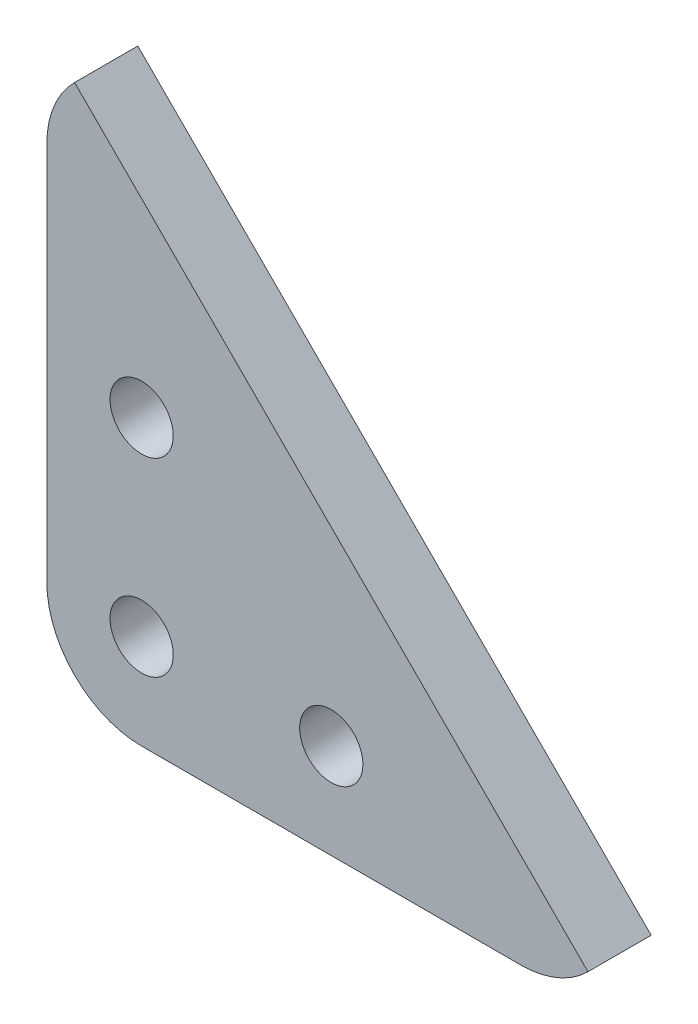
ISO-10303-21;
HEADER;
FILE_DESCRIPTION(('STEP AP214'),'2;1');
FILE_NAME('part.step','',(''),(''),'','','');
FILE_SCHEMA(('AUTOMOTIVE_DESIGN { 1 0 10303 214 1 1 1 1 }'));
ENDSEC;
DATA;
#1=APPLICATION_CONTEXT('core data for automotive mechanical design processes');
#2=APPLICATION_PROTOCOL_DEFINITION('international standard','automotive_design',2000,#1);
#3=PRODUCT_CONTEXT('',#1,'mechanical');
#4=PRODUCT('Part','Part','',(#3));
#5=PRODUCT_RELATED_PRODUCT_CATEGORY('part','',(#4));
#6=PRODUCT_DEFINITION_FORMATION('','',#4);
#7=PRODUCT_DEFINITION_CONTEXT('part definition',#1,'design');
#8=PRODUCT_DEFINITION('design','',#6,#7);
#9=PRODUCT_DEFINITION_SHAPE('','',#8);
#10=(LENGTH_UNIT() NAMED_UNIT(*) SI_UNIT(.MILLI.,.METRE.));
#11=(NAMED_UNIT(*) PLANE_ANGLE_UNIT() SI_UNIT($,.RADIAN.));
#12=(NAMED_UNIT(*) SI_UNIT($,.STERADIAN.) SOLID_ANGLE_UNIT());
#13=UNCERTAINTY_MEASURE_WITH_UNIT(LENGTH_MEASURE(1.E-05),#10,'distance_accuracy_value','');
#14=(GEOMETRIC_REPRESENTATION_CONTEXT(3) GLOBAL_UNCERTAINTY_ASSIGNED_CONTEXT((#13)) GLOBAL_UNIT_ASSIGNED_CONTEXT((#10,
#11,#12)) REPRESENTATION_CONTEXT('',''));
#15=CARTESIAN_POINT('',(0.,0.,0.));
#16=DIRECTION('',(0.,0.,1.));
#17=DIRECTION('',(1.,0.,0.));
#18=AXIS2_PLACEMENT_3D('',#15,#16,#17);
#19=CARTESIAN_POINT('',(-101.443383637,101.056539337921,3.));
#20=DIRECTION('',(0.,0.,1.));
#21=DIRECTION('',(1.,0.,0.));
#22=AXIS2_PLACEMENT_3D('',#19,#20,#21);
#23=PLANE('',#22);
#24=CARTESIAN_POINT('',(-101.443383637,83.056539338,3.));
#25=DIRECTION('',(0.,0.,1.));
#26=DIRECTION('',(1.,0.,0.));
#27=AXIS2_PLACEMENT_3D('',#24,#25,#26);
#28=CIRCLE('',#27,1.5);
#29=CARTESIAN_POINT('',(-99.943383637,83.056539338,3.));
#30=VERTEX_POINT('',#29);
#31=EDGE_CURVE('E185',#30,#30,#28,.T.);
#32=ORIENTED_EDGE('',*,*,#31,.F.);
#33=EDGE_LOOP('',(#32));
#34=FACE_BOUND('',#33,.T.);
#35=CARTESIAN_POINT('',(-101.443383637,101.056539337921,3.));
#36=DIRECTION('',(0.,0.,1.));
#37=DIRECTION('',(1.,0.,0.));
#38=AXIS2_PLACEMENT_3D('',#35,#36,#37);
#39=CIRCLE('',#38,4.50000000000001);
#40=CARTESIAN_POINT('',(-104.6253641523,104.2385198533,3.));
#41=VERTEX_POINT('',#40);
#42=CARTESIAN_POINT('',(-105.943383637,101.056539338,3.));
#43=VERTEX_POINT('',#42);
#44=EDGE_CURVE('E129',#41,#43,#39,.T.);
#45=ORIENTED_EDGE('',*,*,#44,.T.);
#46=DIRECTION('',(0.,-1.,0.));
#47=VECTOR('',#46,1.);
#48=CARTESIAN_POINT('',(-105.943383637,101.056539338,3.));
#49=LINE('',#48,#47);
#50=CARTESIAN_POINT('',(-105.943383637,83.056539338,3.));
#51=VERTEX_POINT('',#50);
#52=EDGE_CURVE('E87',#43,#51,#49,.T.);
#53=ORIENTED_EDGE('',*,*,#52,.T.);
#54=CARTESIAN_POINT('',(-101.443383637,83.056539338,3.));
#55=DIRECTION('',(0.,0.,1.));
#56=DIRECTION('',(1.,0.,0.));
#57=AXIS2_PLACEMENT_3D('',#54,#55,#56);
#58=CIRCLE('',#57,4.5);
#59=CARTESIAN_POINT('',(-101.443383637,78.556539338,3.));
#60=VERTEX_POINT('',#59);
#61=EDGE_CURVE('E100',#51,#60,#58,.T.);
#62=ORIENTED_EDGE('',*,*,#61,.T.);
#63=DIRECTION('',(1.,0.,0.));
#64=VECTOR('',#63,1.);
#65=CARTESIAN_POINT('',(-101.443383637,78.556539338,3.));
#66=LINE('',#65,#64);
#67=CARTESIAN_POINT('',(-83.443383637,78.556539338,3.));
#68=VERTEX_POINT('',#67);
#69=EDGE_CURVE('E94',#60,#68,#66,.T.);
#70=ORIENTED_EDGE('',*,*,#69,.T.);
#71=CARTESIAN_POINT('',(-83.4433836370789,83.056539338,3.));
#72=DIRECTION('',(0.,0.,1.));
#73=DIRECTION('',(1.,0.,0.));
#74=AXIS2_PLACEMENT_3D('',#71,#72,#73);
#75=CIRCLE('',#74,4.5);
#76=CARTESIAN_POINT('',(-80.2614031217,79.8745588227,3.));
#77=VERTEX_POINT('',#76);
#78=EDGE_CURVE('E98',#68,#77,#75,.T.);
#79=ORIENTED_EDGE('',*,*,#78,.T.);
#80=DIRECTION('',(-0.707106781186547,0.707106781186548,0.));
#81=VECTOR('',#80,1.);
#82=CARTESIAN_POINT('',(-104.6253641523,104.2385198533,3.));
#83=LINE('',#82,#81);
#84=EDGE_CURVE('E50',#77,#41,#83,.T.);
#85=ORIENTED_EDGE('',*,*,#84,.T.);
#86=EDGE_LOOP('',(#45,#53,#62,#70,#79,#85));
#87=FACE_BOUND('',#86,.T.);
#88=CARTESIAN_POINT('',(-101.443383637,92.056539338,3.));
#89=DIRECTION('',(0.,0.,1.));
#90=DIRECTION('',(1.,0.,0.));
#91=AXIS2_PLACEMENT_3D('',#88,#89,#90);
#92=CIRCLE('',#91,1.5);
#93=CARTESIAN_POINT('',(-99.943383637,92.056539338,3.));
#94=VERTEX_POINT('',#93);
#95=EDGE_CURVE('E122',#94,#94,#92,.T.);
#96=ORIENTED_EDGE('',*,*,#95,.F.);
#97=EDGE_LOOP('',(#96));
#98=FACE_BOUND('',#97,.T.);
#99=CARTESIAN_POINT('',(-92.443383637,83.056539338,3.));
#100=DIRECTION('',(0.,0.,1.));
#101=DIRECTION('',(1.,0.,0.));
#102=AXIS2_PLACEMENT_3D('',#99,#100,#101);
#103=CIRCLE('',#102,1.5);
#104=CARTESIAN_POINT('',(-90.943383637,83.056539338,3.));
#105=VERTEX_POINT('',#104);
#106=EDGE_CURVE('E176',#105,#105,#103,.T.);
#107=ORIENTED_EDGE('',*,*,#106,.F.);
#108=EDGE_LOOP('',(#107));
#109=FACE_BOUND('',#108,.T.);
#110=ADVANCED_FACE('F33',(#34,#87,#98,#109),#23,.T.);
#111=CARTESIAN_POINT('',(-101.443383637,101.056539337921,0.));
#112=DIRECTION('',(0.,0.,1.));
#113=DIRECTION('',(1.,0.,0.));
#114=AXIS2_PLACEMENT_3D('',#111,#112,#113);
#115=PLANE('',#114);
#116=CARTESIAN_POINT('',(-101.443383637,83.056539338,0.));
#117=DIRECTION('',(0.,0.,1.));
#118=DIRECTION('',(1.,0.,0.));
#119=AXIS2_PLACEMENT_3D('',#116,#117,#118);
#120=CIRCLE('',#119,1.5);
#121=CARTESIAN_POINT('',(-99.943383637,83.056539338,0.));
#122=VERTEX_POINT('',#121);
#123=EDGE_CURVE('E182',#122,#122,#120,.T.);
#124=ORIENTED_EDGE('',*,*,#123,.T.);
#125=EDGE_LOOP('',(#124));
#126=FACE_BOUND('',#125,.T.);
#127=CARTESIAN_POINT('',(-101.443383637,101.056539337921,0.));
#128=DIRECTION('',(0.,0.,1.));
#129=DIRECTION('',(1.,0.,0.));
#130=AXIS2_PLACEMENT_3D('',#127,#128,#129);
#131=CIRCLE('',#130,4.50000000000001);
#132=CARTESIAN_POINT('',(-104.6253641523,104.2385198533,0.));
#133=VERTEX_POINT('',#132);
#134=CARTESIAN_POINT('',(-105.943383637,101.056539338,0.));
#135=VERTEX_POINT('',#134);
#136=EDGE_CURVE('E118',#133,#135,#131,.T.);
#137=ORIENTED_EDGE('',*,*,#136,.F.);
#138=DIRECTION('',(-0.707106781186547,0.707106781186548,0.));
#139=VECTOR('',#138,1.);
#140=CARTESIAN_POINT('',(-104.6253641523,104.2385198533,0.));
#141=LINE('',#140,#139);
#142=CARTESIAN_POINT('',(-80.2614031217,79.8745588227,0.));
#143=VERTEX_POINT('',#142);
#144=EDGE_CURVE('E79',#143,#133,#141,.T.);
#145=ORIENTED_EDGE('',*,*,#144,.F.);
#146=CARTESIAN_POINT('',(-83.4433836370789,83.056539338,0.));
#147=DIRECTION('',(0.,0.,1.));
#148=DIRECTION('',(1.,0.,0.));
#149=AXIS2_PLACEMENT_3D('',#146,#147,#148);
#150=CIRCLE('',#149,4.5);
#151=CARTESIAN_POINT('',(-83.443383637,78.556539338,0.));
#152=VERTEX_POINT('',#151);
#153=EDGE_CURVE('E73',#152,#143,#150,.T.);
#154=ORIENTED_EDGE('',*,*,#153,.F.);
#155=DIRECTION('',(1.,0.,0.));
#156=VECTOR('',#155,1.);
#157=CARTESIAN_POINT('',(-101.443383637,78.556539338,0.));
#158=LINE('',#157,#156);
#159=CARTESIAN_POINT('',(-101.443383637,78.556539338,0.));
#160=VERTEX_POINT('',#159);
#161=EDGE_CURVE('E108',#160,#152,#158,.T.);
#162=ORIENTED_EDGE('',*,*,#161,.F.);
#163=CARTESIAN_POINT('',(-101.443383637,83.056539338,0.));
#164=DIRECTION('',(0.,0.,1.));
#165=DIRECTION('',(1.,0.,0.));
#166=AXIS2_PLACEMENT_3D('',#163,#164,#165);
#167=CIRCLE('',#166,4.5);
#168=CARTESIAN_POINT('',(-105.943383637,83.056539338,0.));
#169=VERTEX_POINT('',#168);
#170=EDGE_CURVE('E124',#169,#160,#167,.T.);
#171=ORIENTED_EDGE('',*,*,#170,.F.);
#172=DIRECTION('',(0.,-1.,0.));
#173=VECTOR('',#172,1.);
#174=CARTESIAN_POINT('',(-105.943383637,101.056539338,0.));
#175=LINE('',#174,#173);
#176=EDGE_CURVE('E121',#135,#169,#175,.T.);
#177=ORIENTED_EDGE('',*,*,#176,.F.);
#178=EDGE_LOOP('',(#137,#145,#154,#162,#171,#177));
#179=FACE_BOUND('',#178,.T.);
#180=CARTESIAN_POINT('',(-101.443383637,92.056539338,0.));
#181=DIRECTION('',(0.,0.,1.));
#182=DIRECTION('',(1.,0.,0.));
#183=AXIS2_PLACEMENT_3D('',#180,#181,#182);
#184=CIRCLE('',#183,1.5);
#185=CARTESIAN_POINT('',(-99.943383637,92.056539338,0.));
#186=VERTEX_POINT('',#185);
#187=EDGE_CURVE('E188',#186,#186,#184,.T.);
#188=ORIENTED_EDGE('',*,*,#187,.T.);
#189=EDGE_LOOP('',(#188));
#190=FACE_BOUND('',#189,.T.);
#191=CARTESIAN_POINT('',(-92.443383637,83.056539338,0.));
#192=DIRECTION('',(0.,0.,1.));
#193=DIRECTION('',(1.,0.,0.));
#194=AXIS2_PLACEMENT_3D('',#191,#192,#193);
#195=CIRCLE('',#194,1.5);
#196=CARTESIAN_POINT('',(-90.943383637,83.056539338,0.));
#197=VERTEX_POINT('',#196);
#198=EDGE_CURVE('E179',#197,#197,#195,.T.);
#199=ORIENTED_EDGE('',*,*,#198,.T.);
#200=EDGE_LOOP('',(#199));
#201=FACE_BOUND('',#200,.T.);
#202=ADVANCED_FACE('F138',(#126,#179,#190,#201),#115,.F.);
#203=CARTESIAN_POINT('',(-101.443383637,101.056539337921,3.));
#204=DIRECTION('',(0.,0.,-1.));
#205=DIRECTION('',(-1.,0.,0.));
#206=AXIS2_PLACEMENT_3D('',#203,#204,#205);
#207=CYLINDRICAL_SURFACE('',#206,4.50000000000001);
#208=ORIENTED_EDGE('',*,*,#136,.T.);
#209=DIRECTION('',(0.,0.,-1.));
#210=VECTOR('',#209,1.);
#211=CARTESIAN_POINT('',(-105.943383637,101.056539338,3.));
#212=LINE('',#211,#210);
#213=EDGE_CURVE('E11',#43,#135,#212,.T.);
#214=ORIENTED_EDGE('',*,*,#213,.F.);
#215=ORIENTED_EDGE('',*,*,#44,.F.);
#216=DIRECTION('',(0.,0.,-1.));
#217=VECTOR('',#216,1.);
#218=CARTESIAN_POINT('',(-104.6253641523,104.2385198533,3.));
#219=LINE('',#218,#217);
#220=EDGE_CURVE('E114',#41,#133,#219,.T.);
#221=ORIENTED_EDGE('',*,*,#220,.T.);
#222=EDGE_LOOP('',(#208,#214,#215,#221));
#223=FACE_BOUND('',#222,.T.);
#224=ADVANCED_FACE('F35',(#223),#207,.T.);
#225=CARTESIAN_POINT('',(-105.943383637,101.056539338,3.));
#226=DIRECTION('',(1.,0.,0.));
#227=DIRECTION('',(0.,0.,-1.));
#228=AXIS2_PLACEMENT_3D('',#225,#226,#227);
#229=PLANE('',#228);
#230=ORIENTED_EDGE('',*,*,#176,.T.);
#231=DIRECTION('',(0.,0.,-1.));
#232=VECTOR('',#231,1.);
#233=CARTESIAN_POINT('',(-105.943383637,83.056539338,3.));
#234=LINE('',#233,#232);
#235=EDGE_CURVE('E42',#51,#169,#234,.T.);
#236=ORIENTED_EDGE('',*,*,#235,.F.);
#237=ORIENTED_EDGE('',*,*,#52,.F.);
#238=ORIENTED_EDGE('',*,*,#213,.T.);
#239=EDGE_LOOP('',(#230,#236,#237,#238));
#240=FACE_BOUND('',#239,.T.);
#241=ADVANCED_FACE('F237',(#240),#229,.F.);
#242=CARTESIAN_POINT('',(-101.443383637,83.056539338,3.));
#243=DIRECTION('',(0.,0.,-1.));
#244=DIRECTION('',(-1.,0.,0.));
#245=AXIS2_PLACEMENT_3D('',#242,#243,#244);
#246=CYLINDRICAL_SURFACE('',#245,4.5);
#247=ORIENTED_EDGE('',*,*,#170,.T.);
#248=DIRECTION('',(0.,0.,-1.));
#249=VECTOR('',#248,1.);
#250=CARTESIAN_POINT('',(-101.443383637,78.556539338,3.));
#251=LINE('',#250,#249);
#252=EDGE_CURVE('E109',#60,#160,#251,.T.);
#253=ORIENTED_EDGE('',*,*,#252,.F.);
#254=ORIENTED_EDGE('',*,*,#61,.F.);
#255=ORIENTED_EDGE('',*,*,#235,.T.);
#256=EDGE_LOOP('',(#247,#253,#254,#255));
#257=FACE_BOUND('',#256,.T.);
#258=ADVANCED_FACE('F135',(#257),#246,.T.);
#259=CARTESIAN_POINT('',(-101.443383637,78.556539338,3.));
#260=DIRECTION('',(0.,1.,0.));
#261=DIRECTION('',(0.,0.,1.));
#262=AXIS2_PLACEMENT_3D('',#259,#260,#261);
#263=PLANE('',#262);
#264=ORIENTED_EDGE('',*,*,#161,.T.);
#265=DIRECTION('',(0.,0.,-1.));
#266=VECTOR('',#265,1.);
#267=CARTESIAN_POINT('',(-83.443383637,78.556539338,3.));
#268=LINE('',#267,#266);
#269=EDGE_CURVE('E105',#68,#152,#268,.T.);
#270=ORIENTED_EDGE('',*,*,#269,.F.);
#271=ORIENTED_EDGE('',*,*,#69,.F.);
#272=ORIENTED_EDGE('',*,*,#252,.T.);
#273=EDGE_LOOP('',(#264,#270,#271,#272));
#274=FACE_BOUND('',#273,.T.);
#275=ADVANCED_FACE('F106',(#274),#263,.F.);
#276=CARTESIAN_POINT('',(-83.4433836370789,83.056539338,3.));
#277=DIRECTION('',(0.,0.,-1.));
#278=DIRECTION('',(-1.,0.,0.));
#279=AXIS2_PLACEMENT_3D('',#276,#277,#278);
#280=CYLINDRICAL_SURFACE('',#279,4.5);
#281=ORIENTED_EDGE('',*,*,#153,.T.);
#282=DIRECTION('',(0.,0.,-1.));
#283=VECTOR('',#282,1.);
#284=CARTESIAN_POINT('',(-80.2614031217,79.8745588227,3.));
#285=LINE('',#284,#283);
#286=EDGE_CURVE('E110',#77,#143,#285,.T.);
#287=ORIENTED_EDGE('',*,*,#286,.F.);
#288=ORIENTED_EDGE('',*,*,#78,.F.);
#289=ORIENTED_EDGE('',*,*,#269,.T.);
#290=EDGE_LOOP('',(#281,#287,#288,#289));
#291=FACE_BOUND('',#290,.T.);
#292=ADVANCED_FACE('F112',(#291),#280,.T.);
#293=CARTESIAN_POINT('',(-104.6253641523,104.2385198533,3.));
#294=DIRECTION('',(-0.707106781186548,-0.707106781186547,0.));
#295=DIRECTION('',(0.707106781186547,-0.707106781186548,0.));
#296=AXIS2_PLACEMENT_3D('',#293,#294,#295);
#297=PLANE('',#296);
#298=ORIENTED_EDGE('',*,*,#144,.T.);
#299=ORIENTED_EDGE('',*,*,#220,.F.);
#300=ORIENTED_EDGE('',*,*,#84,.F.);
#301=ORIENTED_EDGE('',*,*,#286,.T.);
#302=EDGE_LOOP('',(#298,#299,#300,#301));
#303=FACE_BOUND('',#302,.T.);
#304=ADVANCED_FACE('F143',(#303),#297,.F.);
#305=CARTESIAN_POINT('',(-101.443383637,92.056539338,3.));
#306=DIRECTION('',(0.,0.,-1.));
#307=DIRECTION('',(-1.,0.,0.));
#308=AXIS2_PLACEMENT_3D('',#305,#306,#307);
#309=CYLINDRICAL_SURFACE('',#308,1.5);
#310=ORIENTED_EDGE('',*,*,#95,.T.);
#311=EDGE_LOOP('',(#310));
#312=FACE_BOUND('',#311,.T.);
#313=ORIENTED_EDGE('',*,*,#187,.F.);
#314=EDGE_LOOP('',(#313));
#315=FACE_BOUND('',#314,.T.);
#316=ADVANCED_FACE('F145',(#312,#315),#309,.F.);
#317=CARTESIAN_POINT('',(-101.443383637,83.056539338,3.));
#318=DIRECTION('',(0.,0.,-1.));
#319=DIRECTION('',(-1.,0.,0.));
#320=AXIS2_PLACEMENT_3D('',#317,#318,#319);
#321=CYLINDRICAL_SURFACE('',#320,1.5);
#322=ORIENTED_EDGE('',*,*,#31,.T.);
#323=EDGE_LOOP('',(#322));
#324=FACE_BOUND('',#323,.T.);
#325=ORIENTED_EDGE('',*,*,#123,.F.);
#326=EDGE_LOOP('',(#325));
#327=FACE_BOUND('',#326,.T.);
#328=ADVANCED_FACE('F151',(#324,#327),#321,.F.);
#329=CARTESIAN_POINT('',(-92.443383637,83.056539338,3.));
#330=DIRECTION('',(0.,0.,-1.));
#331=DIRECTION('',(-1.,0.,0.));
#332=AXIS2_PLACEMENT_3D('',#329,#330,#331);
#333=CYLINDRICAL_SURFACE('',#332,1.5);
#334=ORIENTED_EDGE('',*,*,#106,.T.);
#335=EDGE_LOOP('',(#334));
#336=FACE_BOUND('',#335,.T.);
#337=ORIENTED_EDGE('',*,*,#198,.F.);
#338=EDGE_LOOP('',(#337));
#339=FACE_BOUND('',#338,.T.);
#340=ADVANCED_FACE('F167',(#336,#339),#333,.F.);
#341=CLOSED_SHELL('',(#110,#202,#224,#241,#258,#275,#292,#304,#316,#328,#340));
#342=MANIFOLD_SOLID_BREP('B2',#341);
#343=ADVANCED_BREP_SHAPE_REPRESENTATION('',(#18,#342),#14);
#344=SHAPE_DEFINITION_REPRESENTATION(#9,#343);
ENDSEC;
END-ISO-10303-21;
